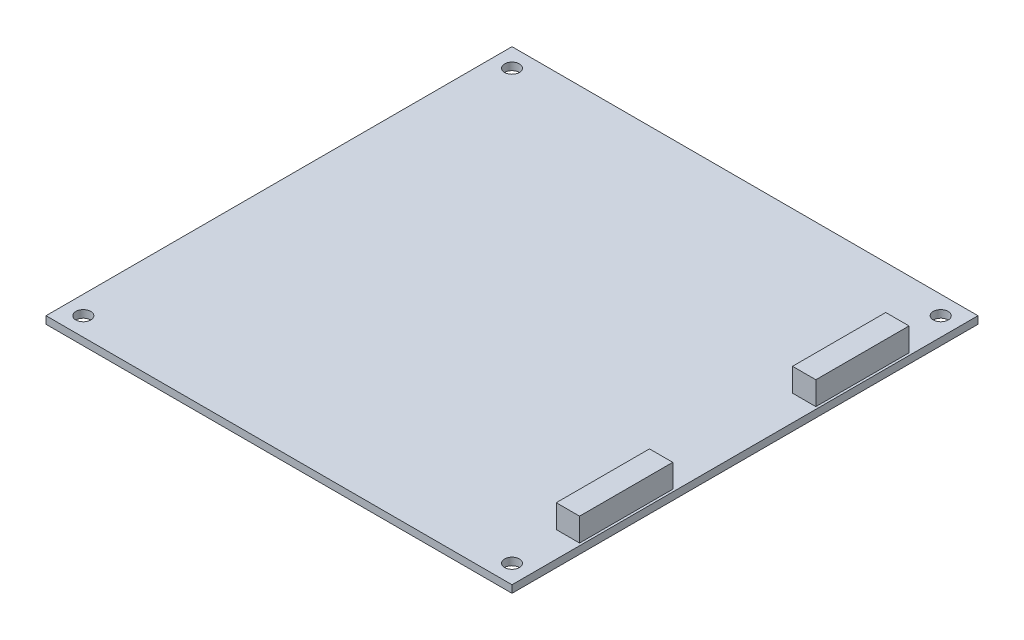
ISO-10303-21;
HEADER;
FILE_DESCRIPTION(('STEP AP214'),'2;1');
FILE_NAME('part.step','',(''),(''),'','','');
FILE_SCHEMA(('AUTOMOTIVE_DESIGN { 1 0 10303 214 1 1 1 1 }'));
ENDSEC;
DATA;
#1=APPLICATION_CONTEXT('core data for automotive mechanical design processes');
#2=APPLICATION_PROTOCOL_DEFINITION('international standard','automotive_design',2000,#1);
#3=PRODUCT_CONTEXT('',#1,'mechanical');
#4=PRODUCT('Part','Part','',(#3));
#5=PRODUCT_RELATED_PRODUCT_CATEGORY('part','',(#4));
#6=PRODUCT_DEFINITION_FORMATION('','',#4);
#7=PRODUCT_DEFINITION_CONTEXT('part definition',#1,'design');
#8=PRODUCT_DEFINITION('design','',#6,#7);
#9=PRODUCT_DEFINITION_SHAPE('','',#8);
#10=(LENGTH_UNIT() NAMED_UNIT(*) SI_UNIT(.MILLI.,.METRE.));
#11=(NAMED_UNIT(*) PLANE_ANGLE_UNIT() SI_UNIT($,.RADIAN.));
#12=(NAMED_UNIT(*) SI_UNIT($,.STERADIAN.) SOLID_ANGLE_UNIT());
#13=UNCERTAINTY_MEASURE_WITH_UNIT(LENGTH_MEASURE(1.E-05),#10,'distance_accuracy_value','');
#14=(GEOMETRIC_REPRESENTATION_CONTEXT(3) GLOBAL_UNCERTAINTY_ASSIGNED_CONTEXT((#13)) GLOBAL_UNIT_ASSIGNED_CONTEXT((#10,
#11,#12)) REPRESENTATION_CONTEXT('',''));
#15=CARTESIAN_POINT('',(0.,0.,0.));
#16=DIRECTION('',(0.,0.,1.));
#17=DIRECTION('',(1.,0.,0.));
#18=AXIS2_PLACEMENT_3D('',#15,#16,#17);
#19=CARTESIAN_POINT('',(0.,1.6,0.));
#20=DIRECTION('',(0.,1.,0.));
#21=DIRECTION('',(0.,0.,1.));
#22=AXIS2_PLACEMENT_3D('',#19,#20,#21);
#23=PLANE('',#22);
#24=CARTESIAN_POINT('',(-46.,1.6,-46.));
#25=DIRECTION('',(0.,1.,0.));
#26=DIRECTION('',(0.,0.,1.));
#27=AXIS2_PLACEMENT_3D('',#24,#25,#26);
#28=CIRCLE('',#27,1.6);
#29=CARTESIAN_POINT('',(-46.,1.6,-44.4));
#30=VERTEX_POINT('',#29);
#31=EDGE_CURVE('E184',#30,#30,#28,.T.);
#32=ORIENTED_EDGE('',*,*,#31,.F.);
#33=EDGE_LOOP('',(#32));
#34=FACE_BOUND('',#33,.T.);
#35=CARTESIAN_POINT('',(46.,1.6,-46.));
#36=DIRECTION('',(0.,1.,0.));
#37=DIRECTION('',(0.,0.,1.));
#38=AXIS2_PLACEMENT_3D('',#35,#36,#37);
#39=CIRCLE('',#38,1.6);
#40=CARTESIAN_POINT('',(46.,1.6,-44.4));
#41=VERTEX_POINT('',#40);
#42=EDGE_CURVE('E190',#41,#41,#39,.T.);
#43=ORIENTED_EDGE('',*,*,#42,.F.);
#44=EDGE_LOOP('',(#43));
#45=FACE_BOUND('',#44,.T.);
#46=CARTESIAN_POINT('',(46.,1.6,46.));
#47=DIRECTION('',(0.,1.,0.));
#48=DIRECTION('',(0.,0.,1.));
#49=AXIS2_PLACEMENT_3D('',#46,#47,#48);
#50=CIRCLE('',#49,1.6);
#51=CARTESIAN_POINT('',(46.,1.6,47.6));
#52=VERTEX_POINT('',#51);
#53=EDGE_CURVE('E179',#52,#52,#50,.T.);
#54=ORIENTED_EDGE('',*,*,#53,.F.);
#55=EDGE_LOOP('',(#54));
#56=FACE_BOUND('',#55,.T.);
#57=CARTESIAN_POINT('',(-46.,1.6,46.));
#58=DIRECTION('',(0.,1.,0.));
#59=DIRECTION('',(0.,0.,1.));
#60=AXIS2_PLACEMENT_3D('',#57,#58,#59);
#61=CIRCLE('',#60,1.6);
#62=CARTESIAN_POINT('',(-46.,1.6,47.6));
#63=VERTEX_POINT('',#62);
#64=EDGE_CURVE('E183',#63,#63,#61,.T.);
#65=ORIENTED_EDGE('',*,*,#64,.F.);
#66=EDGE_LOOP('',(#65));
#67=FACE_BOUND('',#66,.T.);
#68=DIRECTION('',(0.,0.,-1.));
#69=VECTOR('',#68,1.);
#70=CARTESIAN_POINT('',(50.,1.6,-50.));
#71=LINE('',#70,#69);
#72=CARTESIAN_POINT('',(50.,1.6,50.));
#73=VERTEX_POINT('',#72);
#74=CARTESIAN_POINT('',(50.,1.6,-50.));
#75=VERTEX_POINT('',#74);
#76=EDGE_CURVE('E204',#73,#75,#71,.T.);
#77=ORIENTED_EDGE('',*,*,#76,.T.);
#78=DIRECTION('',(-1.,0.,0.));
#79=VECTOR('',#78,1.);
#80=CARTESIAN_POINT('',(-50.,1.6,-50.));
#81=LINE('',#80,#79);
#82=CARTESIAN_POINT('',(-50.,1.6,-50.));
#83=VERTEX_POINT('',#82);
#84=EDGE_CURVE('E207',#75,#83,#81,.T.);
#85=ORIENTED_EDGE('',*,*,#84,.T.);
#86=DIRECTION('',(0.,0.,1.));
#87=VECTOR('',#86,1.);
#88=CARTESIAN_POINT('',(-50.,1.6,-50.));
#89=LINE('',#88,#87);
#90=CARTESIAN_POINT('',(-50.,1.6,50.));
#91=VERTEX_POINT('',#90);
#92=EDGE_CURVE('E210',#83,#91,#89,.T.);
#93=ORIENTED_EDGE('',*,*,#92,.T.);
#94=DIRECTION('',(1.,0.,0.));
#95=VECTOR('',#94,1.);
#96=CARTESIAN_POINT('',(-50.,1.6,50.));
#97=LINE('',#96,#95);
#98=EDGE_CURVE('E212',#91,#73,#97,.T.);
#99=ORIENTED_EDGE('',*,*,#98,.T.);
#100=EDGE_LOOP('',(#77,#85,#93,#99));
#101=FACE_BOUND('',#100,.T.);
#102=DIRECTION('',(-1.,0.,0.));
#103=VECTOR('',#102,1.);
#104=CARTESIAN_POINT('',(44.5,1.6,15.));
#105=LINE('',#104,#103);
#106=CARTESIAN_POINT('',(49.5,1.6,15.));
#107=VERTEX_POINT('',#106);
#108=CARTESIAN_POINT('',(44.5,1.6,15.));
#109=VERTEX_POINT('',#108);
#110=EDGE_CURVE('E151',#107,#109,#105,.T.);
#111=ORIENTED_EDGE('',*,*,#110,.F.);
#112=DIRECTION('',(0.,0.,-1.));
#113=VECTOR('',#112,1.);
#114=CARTESIAN_POINT('',(49.5,1.6,15.));
#115=LINE('',#114,#113);
#116=CARTESIAN_POINT('',(49.5,1.6,35.));
#117=VERTEX_POINT('',#116);
#118=EDGE_CURVE('E148',#117,#107,#115,.T.);
#119=ORIENTED_EDGE('',*,*,#118,.F.);
#120=DIRECTION('',(1.,0.,0.));
#121=VECTOR('',#120,1.);
#122=CARTESIAN_POINT('',(44.5,1.6,35.));
#123=LINE('',#122,#121);
#124=CARTESIAN_POINT('',(44.5,1.6,35.));
#125=VERTEX_POINT('',#124);
#126=EDGE_CURVE('E160',#125,#117,#123,.T.);
#127=ORIENTED_EDGE('',*,*,#126,.F.);
#128=DIRECTION('',(0.,0.,1.));
#129=VECTOR('',#128,1.);
#130=CARTESIAN_POINT('',(44.5,1.6,15.));
#131=LINE('',#130,#129);
#132=EDGE_CURVE('E168',#109,#125,#131,.T.);
#133=ORIENTED_EDGE('',*,*,#132,.F.);
#134=EDGE_LOOP('',(#111,#119,#127,#133));
#135=FACE_BOUND('',#134,.T.);
#136=DIRECTION('',(1.,0.,0.));
#137=VECTOR('',#136,1.);
#138=CARTESIAN_POINT('',(49.5,1.6,-15.7));
#139=LINE('',#138,#137);
#140=CARTESIAN_POINT('',(44.5,1.6,-15.7));
#141=VERTEX_POINT('',#140);
#142=CARTESIAN_POINT('',(49.5,1.6,-15.7));
#143=VERTEX_POINT('',#142);
#144=EDGE_CURVE('E411',#141,#143,#139,.T.);
#145=ORIENTED_EDGE('',*,*,#144,.F.);
#146=DIRECTION('',(0.,0.,1.));
#147=VECTOR('',#146,1.);
#148=CARTESIAN_POINT('',(44.5,1.6,-35.7));
#149=LINE('',#148,#147);
#150=CARTESIAN_POINT('',(44.5,1.6,-35.7));
#151=VERTEX_POINT('',#150);
#152=EDGE_CURVE('E146',#151,#141,#149,.T.);
#153=ORIENTED_EDGE('',*,*,#152,.F.);
#154=DIRECTION('',(-1.,0.,0.));
#155=VECTOR('',#154,1.);
#156=CARTESIAN_POINT('',(49.5,1.6,-35.7));
#157=LINE('',#156,#155);
#158=CARTESIAN_POINT('',(49.5,1.6,-35.7));
#159=VERTEX_POINT('',#158);
#160=EDGE_CURVE('E142',#159,#151,#157,.T.);
#161=ORIENTED_EDGE('',*,*,#160,.F.);
#162=DIRECTION('',(0.,0.,-1.));
#163=VECTOR('',#162,1.);
#164=CARTESIAN_POINT('',(49.5,1.6,-35.7));
#165=LINE('',#164,#163);
#166=EDGE_CURVE('E408',#143,#159,#165,.T.);
#167=ORIENTED_EDGE('',*,*,#166,.F.);
#168=EDGE_LOOP('',(#145,#153,#161,#167));
#169=FACE_BOUND('',#168,.T.);
#170=ADVANCED_FACE('F33',(#34,#45,#56,#67,#101,#135,#169),#23,.T.);
#171=CARTESIAN_POINT('',(50.,1.6,-50.));
#172=DIRECTION('',(-1.,0.,0.));
#173=DIRECTION('',(0.,0.,1.));
#174=AXIS2_PLACEMENT_3D('',#171,#172,#173);
#175=PLANE('',#174);
#176=DIRECTION('',(0.,0.,-1.));
#177=VECTOR('',#176,1.);
#178=CARTESIAN_POINT('',(50.,0.,-50.));
#179=LINE('',#178,#177);
#180=CARTESIAN_POINT('',(50.,0.,50.));
#181=VERTEX_POINT('',#180);
#182=CARTESIAN_POINT('',(50.,0.,-50.));
#183=VERTEX_POINT('',#182);
#184=EDGE_CURVE('E201',#181,#183,#179,.T.);
#185=ORIENTED_EDGE('',*,*,#184,.T.);
#186=DIRECTION('',(0.,-1.,0.));
#187=VECTOR('',#186,1.);
#188=CARTESIAN_POINT('',(50.,1.6,-50.));
#189=LINE('',#188,#187);
#190=EDGE_CURVE('E11',#75,#183,#189,.T.);
#191=ORIENTED_EDGE('',*,*,#190,.F.);
#192=ORIENTED_EDGE('',*,*,#76,.F.);
#193=DIRECTION('',(0.,-1.,0.));
#194=VECTOR('',#193,1.);
#195=CARTESIAN_POINT('',(50.,1.6,50.));
#196=LINE('',#195,#194);
#197=EDGE_CURVE('E214',#73,#181,#196,.T.);
#198=ORIENTED_EDGE('',*,*,#197,.T.);
#199=EDGE_LOOP('',(#185,#191,#192,#198));
#200=FACE_BOUND('',#199,.T.);
#201=ADVANCED_FACE('F35',(#200),#175,.F.);
#202=CARTESIAN_POINT('',(-50.,1.6,-50.));
#203=DIRECTION('',(0.,0.,1.));
#204=DIRECTION('',(1.,0.,0.));
#205=AXIS2_PLACEMENT_3D('',#202,#203,#204);
#206=PLANE('',#205);
#207=DIRECTION('',(-1.,0.,0.));
#208=VECTOR('',#207,1.);
#209=CARTESIAN_POINT('',(-50.,0.,-50.));
#210=LINE('',#209,#208);
#211=CARTESIAN_POINT('',(-50.,0.,-50.));
#212=VERTEX_POINT('',#211);
#213=EDGE_CURVE('E217',#183,#212,#210,.T.);
#214=ORIENTED_EDGE('',*,*,#213,.T.);
#215=DIRECTION('',(0.,-1.,0.));
#216=VECTOR('',#215,1.);
#217=CARTESIAN_POINT('',(-50.,1.6,-50.));
#218=LINE('',#217,#216);
#219=EDGE_CURVE('E41',#83,#212,#218,.T.);
#220=ORIENTED_EDGE('',*,*,#219,.F.);
#221=ORIENTED_EDGE('',*,*,#84,.F.);
#222=ORIENTED_EDGE('',*,*,#190,.T.);
#223=EDGE_LOOP('',(#214,#220,#221,#222));
#224=FACE_BOUND('',#223,.T.);
#225=ADVANCED_FACE('F247',(#224),#206,.F.);
#226=CARTESIAN_POINT('',(-50.,1.6,-50.));
#227=DIRECTION('',(1.,0.,0.));
#228=DIRECTION('',(0.,0.,-1.));
#229=AXIS2_PLACEMENT_3D('',#226,#227,#228);
#230=PLANE('',#229);
#231=DIRECTION('',(0.,0.,1.));
#232=VECTOR('',#231,1.);
#233=CARTESIAN_POINT('',(-50.,0.,-50.));
#234=LINE('',#233,#232);
#235=CARTESIAN_POINT('',(-50.,0.,50.));
#236=VERTEX_POINT('',#235);
#237=EDGE_CURVE('E219',#212,#236,#234,.T.);
#238=ORIENTED_EDGE('',*,*,#237,.T.);
#239=DIRECTION('',(0.,-1.,0.));
#240=VECTOR('',#239,1.);
#241=CARTESIAN_POINT('',(-50.,1.6,50.));
#242=LINE('',#241,#240);
#243=EDGE_CURVE('E224',#91,#236,#242,.T.);
#244=ORIENTED_EDGE('',*,*,#243,.F.);
#245=ORIENTED_EDGE('',*,*,#92,.F.);
#246=ORIENTED_EDGE('',*,*,#219,.T.);
#247=EDGE_LOOP('',(#238,#244,#245,#246));
#248=FACE_BOUND('',#247,.T.);
#249=ADVANCED_FACE('F231',(#248),#230,.F.);
#250=CARTESIAN_POINT('',(-50.,1.6,50.));
#251=DIRECTION('',(0.,0.,-1.));
#252=DIRECTION('',(-1.,0.,0.));
#253=AXIS2_PLACEMENT_3D('',#250,#251,#252);
#254=PLANE('',#253);
#255=DIRECTION('',(1.,0.,0.));
#256=VECTOR('',#255,1.);
#257=CARTESIAN_POINT('',(-50.,0.,50.));
#258=LINE('',#257,#256);
#259=EDGE_CURVE('E208',#236,#181,#258,.T.);
#260=ORIENTED_EDGE('',*,*,#259,.T.);
#261=ORIENTED_EDGE('',*,*,#197,.F.);
#262=ORIENTED_EDGE('',*,*,#98,.F.);
#263=ORIENTED_EDGE('',*,*,#243,.T.);
#264=EDGE_LOOP('',(#260,#261,#262,#263));
#265=FACE_BOUND('',#264,.T.);
#266=ADVANCED_FACE('F240',(#265),#254,.F.);
#267=CARTESIAN_POINT('',(0.,0.,0.));
#268=DIRECTION('',(0.,1.,0.));
#269=DIRECTION('',(0.,0.,1.));
#270=AXIS2_PLACEMENT_3D('',#267,#268,#269);
#271=PLANE('',#270);
#272=CARTESIAN_POINT('',(-46.,0.,-46.));
#273=DIRECTION('',(0.,1.,0.));
#274=DIRECTION('',(0.,0.,1.));
#275=AXIS2_PLACEMENT_3D('',#272,#273,#274);
#276=CIRCLE('',#275,1.6);
#277=CARTESIAN_POINT('',(-46.,0.,-44.4));
#278=VERTEX_POINT('',#277);
#279=EDGE_CURVE('E180',#278,#278,#276,.T.);
#280=ORIENTED_EDGE('',*,*,#279,.T.);
#281=EDGE_LOOP('',(#280));
#282=FACE_BOUND('',#281,.T.);
#283=CARTESIAN_POINT('',(46.,0.,-46.));
#284=DIRECTION('',(0.,1.,0.));
#285=DIRECTION('',(0.,0.,1.));
#286=AXIS2_PLACEMENT_3D('',#283,#284,#285);
#287=CIRCLE('',#286,1.6);
#288=CARTESIAN_POINT('',(46.,0.,-44.4));
#289=VERTEX_POINT('',#288);
#290=EDGE_CURVE('E187',#289,#289,#287,.T.);
#291=ORIENTED_EDGE('',*,*,#290,.T.);
#292=EDGE_LOOP('',(#291));
#293=FACE_BOUND('',#292,.T.);
#294=CARTESIAN_POINT('',(46.,0.,46.));
#295=DIRECTION('',(0.,1.,0.));
#296=DIRECTION('',(0.,0.,1.));
#297=AXIS2_PLACEMENT_3D('',#294,#295,#296);
#298=CIRCLE('',#297,1.6);
#299=CARTESIAN_POINT('',(46.,0.,47.6));
#300=VERTEX_POINT('',#299);
#301=EDGE_CURVE('E193',#300,#300,#298,.T.);
#302=ORIENTED_EDGE('',*,*,#301,.T.);
#303=EDGE_LOOP('',(#302));
#304=FACE_BOUND('',#303,.T.);
#305=CARTESIAN_POINT('',(-46.,0.,46.));
#306=DIRECTION('',(0.,1.,0.));
#307=DIRECTION('',(0.,0.,1.));
#308=AXIS2_PLACEMENT_3D('',#305,#306,#307);
#309=CIRCLE('',#308,1.6);
#310=CARTESIAN_POINT('',(-46.,0.,47.6));
#311=VERTEX_POINT('',#310);
#312=EDGE_CURVE('E198',#311,#311,#309,.T.);
#313=ORIENTED_EDGE('',*,*,#312,.T.);
#314=EDGE_LOOP('',(#313));
#315=FACE_BOUND('',#314,.T.);
#316=ORIENTED_EDGE('',*,*,#184,.F.);
#317=ORIENTED_EDGE('',*,*,#259,.F.);
#318=ORIENTED_EDGE('',*,*,#237,.F.);
#319=ORIENTED_EDGE('',*,*,#213,.F.);
#320=EDGE_LOOP('',(#316,#317,#318,#319));
#321=FACE_BOUND('',#320,.T.);
#322=ADVANCED_FACE('F237',(#282,#293,#304,#315,#321),#271,.F.);
#323=CARTESIAN_POINT('',(-46.,0.,46.));
#324=DIRECTION('',(0.,1.,0.));
#325=DIRECTION('',(0.,0.,1.));
#326=AXIS2_PLACEMENT_3D('',#323,#324,#325);
#327=CYLINDRICAL_SURFACE('',#326,1.6);
#328=ORIENTED_EDGE('',*,*,#312,.F.);
#329=EDGE_LOOP('',(#328));
#330=FACE_BOUND('',#329,.T.);
#331=ORIENTED_EDGE('',*,*,#64,.T.);
#332=EDGE_LOOP('',(#331));
#333=FACE_BOUND('',#332,.T.);
#334=ADVANCED_FACE('F265',(#330,#333),#327,.F.);
#335=CARTESIAN_POINT('',(46.,0.,46.));
#336=DIRECTION('',(0.,1.,0.));
#337=DIRECTION('',(0.,0.,1.));
#338=AXIS2_PLACEMENT_3D('',#335,#336,#337);
#339=CYLINDRICAL_SURFACE('',#338,1.6);
#340=ORIENTED_EDGE('',*,*,#301,.F.);
#341=EDGE_LOOP('',(#340));
#342=FACE_BOUND('',#341,.T.);
#343=ORIENTED_EDGE('',*,*,#53,.T.);
#344=EDGE_LOOP('',(#343));
#345=FACE_BOUND('',#344,.T.);
#346=ADVANCED_FACE('F285',(#342,#345),#339,.F.);
#347=CARTESIAN_POINT('',(46.,0.,-46.));
#348=DIRECTION('',(0.,1.,0.));
#349=DIRECTION('',(0.,0.,1.));
#350=AXIS2_PLACEMENT_3D('',#347,#348,#349);
#351=CYLINDRICAL_SURFACE('',#350,1.6);
#352=ORIENTED_EDGE('',*,*,#290,.F.);
#353=EDGE_LOOP('',(#352));
#354=FACE_BOUND('',#353,.T.);
#355=ORIENTED_EDGE('',*,*,#42,.T.);
#356=EDGE_LOOP('',(#355));
#357=FACE_BOUND('',#356,.T.);
#358=ADVANCED_FACE('F292',(#354,#357),#351,.F.);
#359=CARTESIAN_POINT('',(-46.,0.,-46.));
#360=DIRECTION('',(0.,1.,0.));
#361=DIRECTION('',(0.,0.,1.));
#362=AXIS2_PLACEMENT_3D('',#359,#360,#361);
#363=CYLINDRICAL_SURFACE('',#362,1.6);
#364=ORIENTED_EDGE('',*,*,#279,.F.);
#365=EDGE_LOOP('',(#364));
#366=FACE_BOUND('',#365,.T.);
#367=ORIENTED_EDGE('',*,*,#31,.T.);
#368=EDGE_LOOP('',(#367));
#369=FACE_BOUND('',#368,.T.);
#370=ADVANCED_FACE('F299',(#366,#369),#363,.F.);
#371=CARTESIAN_POINT('',(49.5,6.6,15.));
#372=DIRECTION('',(-1.,0.,0.));
#373=DIRECTION('',(0.,0.,1.));
#374=AXIS2_PLACEMENT_3D('',#371,#372,#373);
#375=PLANE('',#374);
#376=ORIENTED_EDGE('',*,*,#118,.T.);
#377=DIRECTION('',(0.,-1.,0.));
#378=VECTOR('',#377,1.);
#379=CARTESIAN_POINT('',(49.5,6.6,15.));
#380=LINE('',#379,#378);
#381=CARTESIAN_POINT('',(49.5,6.6,15.));
#382=VERTEX_POINT('',#381);
#383=EDGE_CURVE('E177',#382,#107,#380,.T.);
#384=ORIENTED_EDGE('',*,*,#383,.F.);
#385=DIRECTION('',(0.,0.,-1.));
#386=VECTOR('',#385,1.);
#387=CARTESIAN_POINT('',(49.5,6.6,15.));
#388=LINE('',#387,#386);
#389=CARTESIAN_POINT('',(49.5,6.6,35.));
#390=VERTEX_POINT('',#389);
#391=EDGE_CURVE('E156',#390,#382,#388,.T.);
#392=ORIENTED_EDGE('',*,*,#391,.F.);
#393=DIRECTION('',(0.,-1.,0.));
#394=VECTOR('',#393,1.);
#395=CARTESIAN_POINT('',(49.5,6.6,35.));
#396=LINE('',#395,#394);
#397=EDGE_CURVE('E165',#390,#117,#396,.T.);
#398=ORIENTED_EDGE('',*,*,#397,.T.);
#399=EDGE_LOOP('',(#376,#384,#392,#398));
#400=FACE_BOUND('',#399,.T.);
#401=ADVANCED_FACE('F305',(#400),#375,.F.);
#402=CARTESIAN_POINT('',(44.5,6.6,15.));
#403=DIRECTION('',(0.,0.,1.));
#404=DIRECTION('',(1.,0.,0.));
#405=AXIS2_PLACEMENT_3D('',#402,#403,#404);
#406=PLANE('',#405);
#407=ORIENTED_EDGE('',*,*,#110,.T.);
#408=DIRECTION('',(0.,-1.,0.));
#409=VECTOR('',#408,1.);
#410=CARTESIAN_POINT('',(44.5,6.6,15.));
#411=LINE('',#410,#409);
#412=CARTESIAN_POINT('',(44.5,6.6,15.));
#413=VERTEX_POINT('',#412);
#414=EDGE_CURVE('E174',#413,#109,#411,.T.);
#415=ORIENTED_EDGE('',*,*,#414,.F.);
#416=DIRECTION('',(-1.,0.,0.));
#417=VECTOR('',#416,1.);
#418=CARTESIAN_POINT('',(44.5,6.6,15.));
#419=LINE('',#418,#417);
#420=EDGE_CURVE('E159',#382,#413,#419,.T.);
#421=ORIENTED_EDGE('',*,*,#420,.F.);
#422=ORIENTED_EDGE('',*,*,#383,.T.);
#423=EDGE_LOOP('',(#407,#415,#421,#422));
#424=FACE_BOUND('',#423,.T.);
#425=ADVANCED_FACE('F318',(#424),#406,.F.);
#426=CARTESIAN_POINT('',(44.5,6.6,15.));
#427=DIRECTION('',(1.,0.,0.));
#428=DIRECTION('',(0.,0.,-1.));
#429=AXIS2_PLACEMENT_3D('',#426,#427,#428);
#430=PLANE('',#429);
#431=ORIENTED_EDGE('',*,*,#132,.T.);
#432=DIRECTION('',(0.,-1.,0.));
#433=VECTOR('',#432,1.);
#434=CARTESIAN_POINT('',(44.5,6.6,35.));
#435=LINE('',#434,#433);
#436=CARTESIAN_POINT('',(44.5,6.6,35.));
#437=VERTEX_POINT('',#436);
#438=EDGE_CURVE('E56',#437,#125,#435,.T.);
#439=ORIENTED_EDGE('',*,*,#438,.F.);
#440=DIRECTION('',(0.,0.,1.));
#441=VECTOR('',#440,1.);
#442=CARTESIAN_POINT('',(44.5,6.6,15.));
#443=LINE('',#442,#441);
#444=EDGE_CURVE('E162',#413,#437,#443,.T.);
#445=ORIENTED_EDGE('',*,*,#444,.F.);
#446=ORIENTED_EDGE('',*,*,#414,.T.);
#447=EDGE_LOOP('',(#431,#439,#445,#446));
#448=FACE_BOUND('',#447,.T.);
#449=ADVANCED_FACE('F325',(#448),#430,.F.);
#450=CARTESIAN_POINT('',(44.5,6.6,35.));
#451=DIRECTION('',(0.,0.,-1.));
#452=DIRECTION('',(-1.,0.,0.));
#453=AXIS2_PLACEMENT_3D('',#450,#451,#452);
#454=PLANE('',#453);
#455=ORIENTED_EDGE('',*,*,#126,.T.);
#456=ORIENTED_EDGE('',*,*,#397,.F.);
#457=DIRECTION('',(1.,0.,0.));
#458=VECTOR('',#457,1.);
#459=CARTESIAN_POINT('',(44.5,6.6,35.));
#460=LINE('',#459,#458);
#461=EDGE_CURVE('E164',#437,#390,#460,.T.);
#462=ORIENTED_EDGE('',*,*,#461,.F.);
#463=ORIENTED_EDGE('',*,*,#438,.T.);
#464=EDGE_LOOP('',(#455,#456,#462,#463));
#465=FACE_BOUND('',#464,.T.);
#466=ADVANCED_FACE('F333',(#465),#454,.F.);
#467=CARTESIAN_POINT('',(0.,6.6,0.));
#468=DIRECTION('',(0.,1.,0.));
#469=DIRECTION('',(0.,0.,1.));
#470=AXIS2_PLACEMENT_3D('',#467,#468,#469);
#471=PLANE('',#470);
#472=ORIENTED_EDGE('',*,*,#391,.T.);
#473=ORIENTED_EDGE('',*,*,#420,.T.);
#474=ORIENTED_EDGE('',*,*,#444,.T.);
#475=ORIENTED_EDGE('',*,*,#461,.T.);
#476=EDGE_LOOP('',(#472,#473,#474,#475));
#477=FACE_BOUND('',#476,.T.);
#478=ADVANCED_FACE('F341',(#477),#471,.T.);
#479=CARTESIAN_POINT('',(44.5,6.6,-35.7));
#480=DIRECTION('',(1.,0.,0.));
#481=DIRECTION('',(0.,0.,-1.));
#482=AXIS2_PLACEMENT_3D('',#479,#480,#481);
#483=PLANE('',#482);
#484=ORIENTED_EDGE('',*,*,#152,.T.);
#485=DIRECTION('',(0.,-1.,0.));
#486=VECTOR('',#485,1.);
#487=CARTESIAN_POINT('',(44.5,6.6,-15.7));
#488=LINE('',#487,#486);
#489=CARTESIAN_POINT('',(44.5,6.6,-15.7));
#490=VERTEX_POINT('',#489);
#491=EDGE_CURVE('E127',#490,#141,#488,.T.);
#492=ORIENTED_EDGE('',*,*,#491,.F.);
#493=DIRECTION('',(0.,0.,1.));
#494=VECTOR('',#493,1.);
#495=CARTESIAN_POINT('',(44.5,6.6,-35.7));
#496=LINE('',#495,#494);
#497=CARTESIAN_POINT('',(44.5,6.6,-35.7));
#498=VERTEX_POINT('',#497);
#499=EDGE_CURVE('E134',#498,#490,#496,.T.);
#500=ORIENTED_EDGE('',*,*,#499,.F.);
#501=DIRECTION('',(0.,-1.,0.));
#502=VECTOR('',#501,1.);
#503=CARTESIAN_POINT('',(44.5,6.6,-35.7));
#504=LINE('',#503,#502);
#505=EDGE_CURVE('E405',#498,#151,#504,.T.);
#506=ORIENTED_EDGE('',*,*,#505,.T.);
#507=EDGE_LOOP('',(#484,#492,#500,#506));
#508=FACE_BOUND('',#507,.T.);
#509=ADVANCED_FACE('F144',(#508),#483,.F.);
#510=CARTESIAN_POINT('',(49.5,6.6,-15.7));
#511=DIRECTION('',(0.,0.,-1.));
#512=DIRECTION('',(-1.,0.,0.));
#513=AXIS2_PLACEMENT_3D('',#510,#511,#512);
#514=PLANE('',#513);
#515=ORIENTED_EDGE('',*,*,#144,.T.);
#516=DIRECTION('',(0.,-1.,0.));
#517=VECTOR('',#516,1.);
#518=CARTESIAN_POINT('',(49.5,6.6,-15.7));
#519=LINE('',#518,#517);
#520=CARTESIAN_POINT('',(49.5,6.6,-15.7));
#521=VERTEX_POINT('',#520);
#522=EDGE_CURVE('E130',#521,#143,#519,.T.);
#523=ORIENTED_EDGE('',*,*,#522,.F.);
#524=DIRECTION('',(1.,0.,0.));
#525=VECTOR('',#524,1.);
#526=CARTESIAN_POINT('',(49.5,6.6,-15.7));
#527=LINE('',#526,#525);
#528=EDGE_CURVE('E123',#490,#521,#527,.T.);
#529=ORIENTED_EDGE('',*,*,#528,.F.);
#530=ORIENTED_EDGE('',*,*,#491,.T.);
#531=EDGE_LOOP('',(#515,#523,#529,#530));
#532=FACE_BOUND('',#531,.T.);
#533=ADVANCED_FACE('F125',(#532),#514,.F.);
#534=CARTESIAN_POINT('',(49.5,6.6,-35.7));
#535=DIRECTION('',(-1.,0.,0.));
#536=DIRECTION('',(0.,0.,1.));
#537=AXIS2_PLACEMENT_3D('',#534,#535,#536);
#538=PLANE('',#537);
#539=ORIENTED_EDGE('',*,*,#166,.T.);
#540=DIRECTION('',(0.,-1.,0.));
#541=VECTOR('',#540,1.);
#542=CARTESIAN_POINT('',(49.5,6.6,-35.7));
#543=LINE('',#542,#541);
#544=CARTESIAN_POINT('',(49.5,6.6,-35.7));
#545=VERTEX_POINT('',#544);
#546=EDGE_CURVE('E48',#545,#159,#543,.T.);
#547=ORIENTED_EDGE('',*,*,#546,.F.);
#548=DIRECTION('',(0.,0.,-1.));
#549=VECTOR('',#548,1.);
#550=CARTESIAN_POINT('',(49.5,6.6,-35.7));
#551=LINE('',#550,#549);
#552=EDGE_CURVE('E133',#521,#545,#551,.T.);
#553=ORIENTED_EDGE('',*,*,#552,.F.);
#554=ORIENTED_EDGE('',*,*,#522,.T.);
#555=EDGE_LOOP('',(#539,#547,#553,#554));
#556=FACE_BOUND('',#555,.T.);
#557=ADVANCED_FACE('F361',(#556),#538,.F.);
#558=CARTESIAN_POINT('',(49.5,6.6,-35.7));
#559=DIRECTION('',(0.,0.,1.));
#560=DIRECTION('',(1.,0.,0.));
#561=AXIS2_PLACEMENT_3D('',#558,#559,#560);
#562=PLANE('',#561);
#563=ORIENTED_EDGE('',*,*,#160,.T.);
#564=ORIENTED_EDGE('',*,*,#505,.F.);
#565=DIRECTION('',(-1.,0.,0.));
#566=VECTOR('',#565,1.);
#567=CARTESIAN_POINT('',(49.5,6.6,-35.7));
#568=LINE('',#567,#566);
#569=EDGE_CURVE('E138',#545,#498,#568,.T.);
#570=ORIENTED_EDGE('',*,*,#569,.F.);
#571=ORIENTED_EDGE('',*,*,#546,.T.);
#572=EDGE_LOOP('',(#563,#564,#570,#571));
#573=FACE_BOUND('',#572,.T.);
#574=ADVANCED_FACE('F368',(#573),#562,.F.);
#575=CARTESIAN_POINT('',(0.,6.6,0.));
#576=DIRECTION('',(0.,-1.,0.));
#577=DIRECTION('',(0.,0.,-1.));
#578=AXIS2_PLACEMENT_3D('',#575,#576,#577);
#579=PLANE('',#578);
#580=ORIENTED_EDGE('',*,*,#499,.T.);
#581=ORIENTED_EDGE('',*,*,#528,.T.);
#582=ORIENTED_EDGE('',*,*,#552,.T.);
#583=ORIENTED_EDGE('',*,*,#569,.T.);
#584=EDGE_LOOP('',(#580,#581,#582,#583));
#585=FACE_BOUND('',#584,.T.);
#586=ADVANCED_FACE('F137',(#585),#579,.F.);
#587=CLOSED_SHELL('',(#170,#201,#225,#249,#266,#322,#334,#346,#358,#370,#401,#425,#449,#466,
#478,#509,#533,#557,#574,#586));
#588=MANIFOLD_SOLID_BREP('B2',#587);
#589=ADVANCED_BREP_SHAPE_REPRESENTATION('',(#18,#588),#14);
#590=SHAPE_DEFINITION_REPRESENTATION(#9,#589);
ENDSEC;
END-ISO-10303-21;
